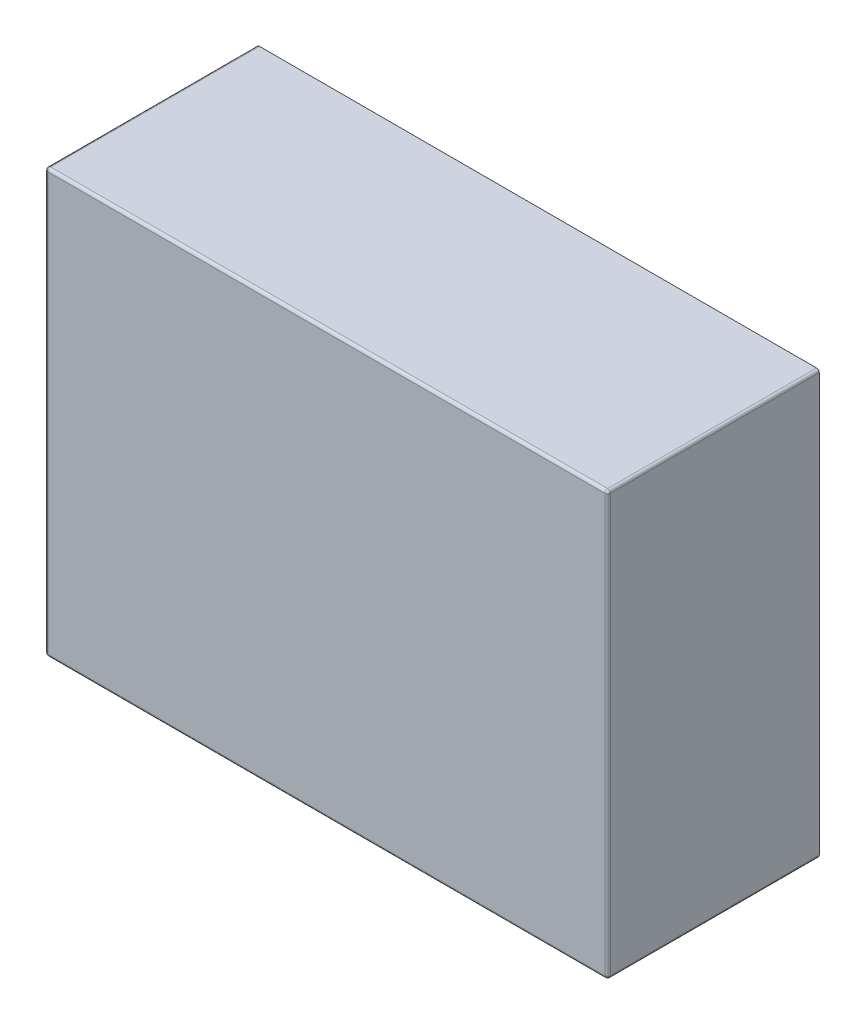
ISO-10303-21;
HEADER;
FILE_DESCRIPTION(('STEP AP214'),'2;1');
FILE_NAME('part.step','',(''),(''),'','','');
FILE_SCHEMA(('AUTOMOTIVE_DESIGN { 1 0 10303 214 1 1 1 1 }'));
ENDSEC;
DATA;
#1=APPLICATION_CONTEXT('core data for automotive mechanical design processes');
#2=APPLICATION_PROTOCOL_DEFINITION('international standard','automotive_design',2000,#1);
#3=PRODUCT_CONTEXT('',#1,'mechanical');
#4=PRODUCT('Part','Part','',(#3));
#5=PRODUCT_RELATED_PRODUCT_CATEGORY('part','',(#4));
#6=PRODUCT_DEFINITION_FORMATION('','',#4);
#7=PRODUCT_DEFINITION_CONTEXT('part definition',#1,'design');
#8=PRODUCT_DEFINITION('design','',#6,#7);
#9=PRODUCT_DEFINITION_SHAPE('','',#8);
#10=(LENGTH_UNIT() NAMED_UNIT(*) SI_UNIT(.MILLI.,.METRE.));
#11=(NAMED_UNIT(*) PLANE_ANGLE_UNIT() SI_UNIT($,.RADIAN.));
#12=(NAMED_UNIT(*) SI_UNIT($,.STERADIAN.) SOLID_ANGLE_UNIT());
#13=UNCERTAINTY_MEASURE_WITH_UNIT(LENGTH_MEASURE(1.E-05),#10,'distance_accuracy_value','');
#14=(GEOMETRIC_REPRESENTATION_CONTEXT(3) GLOBAL_UNCERTAINTY_ASSIGNED_CONTEXT((#13)) GLOBAL_UNIT_ASSIGNED_CONTEXT((#10,
#11,#12)) REPRESENTATION_CONTEXT('',''));
#15=CARTESIAN_POINT('',(0.,0.,0.));
#16=DIRECTION('',(0.,0.,1.));
#17=DIRECTION('',(1.,0.,0.));
#18=AXIS2_PLACEMENT_3D('',#15,#16,#17);
#19=CARTESIAN_POINT('',(0.,0.,152.));
#20=DIRECTION('',(0.,0.,1.));
#21=DIRECTION('',(1.,0.,0.));
#22=AXIS2_PLACEMENT_3D('',#19,#20,#21);
#23=PLANE('',#22);
#24=DIRECTION('',(1.,0.,0.));
#25=VECTOR('',#24,1.);
#26=CARTESIAN_POINT('',(-200.,-150.,152.));
#27=LINE('',#26,#25);
#28=CARTESIAN_POINT('',(-200.,-150.,152.));
#29=VERTEX_POINT('',#28);
#30=CARTESIAN_POINT('',(200.,-150.,152.));
#31=VERTEX_POINT('',#30);
#32=EDGE_CURVE('E315',#29,#31,#27,.T.);
#33=ORIENTED_EDGE('',*,*,#32,.T.);
#34=DIRECTION('',(0.,1.,0.));
#35=VECTOR('',#34,1.);
#36=CARTESIAN_POINT('',(200.,-150.,152.));
#37=LINE('',#36,#35);
#38=CARTESIAN_POINT('',(200.,150.,152.));
#39=VERTEX_POINT('',#38);
#40=EDGE_CURVE('E45',#31,#39,#37,.T.);
#41=ORIENTED_EDGE('',*,*,#40,.T.);
#42=DIRECTION('',(-1.,0.,0.));
#43=VECTOR('',#42,1.);
#44=CARTESIAN_POINT('',(200.,150.,152.));
#45=LINE('',#44,#43);
#46=CARTESIAN_POINT('',(-200.,150.,152.));
#47=VERTEX_POINT('',#46);
#48=EDGE_CURVE('E10',#39,#47,#45,.T.);
#49=ORIENTED_EDGE('',*,*,#48,.T.);
#50=DIRECTION('',(0.,-1.,0.));
#51=VECTOR('',#50,1.);
#52=CARTESIAN_POINT('',(-200.,150.,152.));
#53=LINE('',#52,#51);
#54=EDGE_CURVE('E282',#47,#29,#53,.T.);
#55=ORIENTED_EDGE('',*,*,#54,.T.);
#56=EDGE_LOOP('',(#33,#41,#49,#55));
#57=FACE_BOUND('',#56,.T.);
#58=ADVANCED_FACE('F16',(#57),#23,.T.);
#59=CARTESIAN_POINT('',(200.,150.,150.));
#60=DIRECTION('',(-1.,0.,0.));
#61=DIRECTION('',(0.,0.,-1.));
#62=AXIS2_PLACEMENT_3D('',#59,#60,#61);
#63=CYLINDRICAL_SURFACE('',#62,2.);
#64=CARTESIAN_POINT('',(-200.,150.,150.));
#65=DIRECTION('',(1.,0.,0.));
#66=DIRECTION('',(0.,0.,-1.));
#67=AXIS2_PLACEMENT_3D('',#64,#65,#66);
#68=CIRCLE('',#67,2.);
#69=CARTESIAN_POINT('',(-200.,152.,150.));
#70=VERTEX_POINT('',#69);
#71=EDGE_CURVE('E283',#70,#47,#68,.T.);
#72=ORIENTED_EDGE('',*,*,#71,.T.);
#73=ORIENTED_EDGE('',*,*,#48,.F.);
#74=CARTESIAN_POINT('',(200.,150.,150.));
#75=DIRECTION('',(1.,0.,0.));
#76=DIRECTION('',(0.,0.,-1.));
#77=AXIS2_PLACEMENT_3D('',#74,#75,#76);
#78=CIRCLE('',#77,2.);
#79=CARTESIAN_POINT('',(200.,152.,150.));
#80=VERTEX_POINT('',#79);
#81=EDGE_CURVE('E25',#80,#39,#78,.T.);
#82=ORIENTED_EDGE('',*,*,#81,.F.);
#83=DIRECTION('',(-1.,0.,0.));
#84=VECTOR('',#83,1.);
#85=CARTESIAN_POINT('',(200.,152.,150.));
#86=LINE('',#85,#84);
#87=EDGE_CURVE('E302',#80,#70,#86,.T.);
#88=ORIENTED_EDGE('',*,*,#87,.T.);
#89=EDGE_LOOP('',(#72,#73,#82,#88));
#90=FACE_BOUND('',#89,.T.);
#91=ADVANCED_FACE('F366',(#90),#63,.T.);
#92=CARTESIAN_POINT('',(200.,150.,150.));
#93=DIRECTION('',(0.,0.707106781186548,-0.707106781186548));
#94=DIRECTION('',(-0.577350269189626,-0.577350269189626,-0.577350269189626));
#95=AXIS2_PLACEMENT_3D('',#92,#93,#94);
#96=SPHERICAL_SURFACE('',#95,2.);
#97=CARTESIAN_POINT('',(200.,150.,150.));
#98=DIRECTION('',(0.,0.,1.));
#99=DIRECTION('',(0.,-1.,0.));
#100=AXIS2_PLACEMENT_3D('',#97,#98,#99);
#101=CIRCLE('',#100,2.);
#102=CARTESIAN_POINT('',(202.,150.,150.));
#103=VERTEX_POINT('',#102);
#104=EDGE_CURVE('E244',#103,#80,#101,.T.);
#105=ORIENTED_EDGE('',*,*,#104,.T.);
#106=ORIENTED_EDGE('',*,*,#81,.T.);
#107=CARTESIAN_POINT('',(200.,150.,150.));
#108=DIRECTION('',(0.,-1.,0.));
#109=DIRECTION('',(0.,0.,-1.));
#110=AXIS2_PLACEMENT_3D('',#107,#108,#109);
#111=CIRCLE('',#110,2.);
#112=EDGE_CURVE('E189',#103,#39,#111,.T.);
#113=ORIENTED_EDGE('',*,*,#112,.F.);
#114=EDGE_LOOP('',(#105,#106,#113));
#115=FACE_BOUND('',#114,.T.);
#116=ADVANCED_FACE('F334',(#115),#96,.T.);
#117=CARTESIAN_POINT('',(200.,-150.,150.));
#118=DIRECTION('',(0.,1.,0.));
#119=DIRECTION('',(0.,0.,-1.));
#120=AXIS2_PLACEMENT_3D('',#117,#118,#119);
#121=CYLINDRICAL_SURFACE('',#120,2.);
#122=ORIENTED_EDGE('',*,*,#112,.T.);
#123=ORIENTED_EDGE('',*,*,#40,.F.);
#124=CARTESIAN_POINT('',(200.,-150.,150.));
#125=DIRECTION('',(0.,-1.,0.));
#126=DIRECTION('',(0.,0.,-1.));
#127=AXIS2_PLACEMENT_3D('',#124,#125,#126);
#128=CIRCLE('',#127,2.);
#129=CARTESIAN_POINT('',(202.,-150.,150.));
#130=VERTEX_POINT('',#129);
#131=EDGE_CURVE('E312',#130,#31,#128,.T.);
#132=ORIENTED_EDGE('',*,*,#131,.F.);
#133=DIRECTION('',(0.,1.,0.));
#134=VECTOR('',#133,1.);
#135=CARTESIAN_POINT('',(202.,-150.,150.));
#136=LINE('',#135,#134);
#137=EDGE_CURVE('E292',#130,#103,#136,.T.);
#138=ORIENTED_EDGE('',*,*,#137,.T.);
#139=EDGE_LOOP('',(#122,#123,#132,#138));
#140=FACE_BOUND('',#139,.T.);
#141=ADVANCED_FACE('F339',(#140),#121,.T.);
#142=CARTESIAN_POINT('',(200.,-150.,150.));
#143=DIRECTION('',(0.707106781186548,0.,-0.707106781186548));
#144=DIRECTION('',(-0.577350269189626,0.577350269189626,-0.577350269189626));
#145=AXIS2_PLACEMENT_3D('',#142,#143,#144);
#146=SPHERICAL_SURFACE('',#145,2.);
#147=CARTESIAN_POINT('',(200.,-150.,150.));
#148=DIRECTION('',(0.,0.,1.));
#149=DIRECTION('',(-1.,0.,0.));
#150=AXIS2_PLACEMENT_3D('',#147,#148,#149);
#151=CIRCLE('',#150,2.);
#152=CARTESIAN_POINT('',(200.,-152.,150.));
#153=VERTEX_POINT('',#152);
#154=EDGE_CURVE('E288',#153,#130,#151,.T.);
#155=ORIENTED_EDGE('',*,*,#154,.T.);
#156=ORIENTED_EDGE('',*,*,#131,.T.);
#157=CARTESIAN_POINT('',(200.,-150.,150.));
#158=DIRECTION('',(-1.,0.,0.));
#159=DIRECTION('',(0.,0.,-1.));
#160=AXIS2_PLACEMENT_3D('',#157,#158,#159);
#161=CIRCLE('',#160,2.);
#162=EDGE_CURVE('E323',#153,#31,#161,.T.);
#163=ORIENTED_EDGE('',*,*,#162,.F.);
#164=EDGE_LOOP('',(#155,#156,#163));
#165=FACE_BOUND('',#164,.T.);
#166=ADVANCED_FACE('F18',(#165),#146,.T.);
#167=CARTESIAN_POINT('',(-200.,-150.,150.));
#168=DIRECTION('',(1.,0.,0.));
#169=DIRECTION('',(0.,0.,-1.));
#170=AXIS2_PLACEMENT_3D('',#167,#168,#169);
#171=CYLINDRICAL_SURFACE('',#170,2.);
#172=ORIENTED_EDGE('',*,*,#162,.T.);
#173=ORIENTED_EDGE('',*,*,#32,.F.);
#174=CARTESIAN_POINT('',(-200.,-150.,150.));
#175=DIRECTION('',(-1.,0.,0.));
#176=DIRECTION('',(0.,0.,-1.));
#177=AXIS2_PLACEMENT_3D('',#174,#175,#176);
#178=CIRCLE('',#177,2.);
#179=CARTESIAN_POINT('',(-200.,-152.,150.));
#180=VERTEX_POINT('',#179);
#181=EDGE_CURVE('E319',#180,#29,#178,.T.);
#182=ORIENTED_EDGE('',*,*,#181,.F.);
#183=DIRECTION('',(1.,0.,0.));
#184=VECTOR('',#183,1.);
#185=CARTESIAN_POINT('',(-200.,-152.,150.));
#186=LINE('',#185,#184);
#187=EDGE_CURVE('E277',#180,#153,#186,.T.);
#188=ORIENTED_EDGE('',*,*,#187,.T.);
#189=EDGE_LOOP('',(#172,#173,#182,#188));
#190=FACE_BOUND('',#189,.T.);
#191=ADVANCED_FACE('F384',(#190),#171,.T.);
#192=CARTESIAN_POINT('',(-200.,-150.,150.));
#193=DIRECTION('',(0.707106781186548,0.,0.707106781186548));
#194=DIRECTION('',(0.577350269189626,0.577350269189626,-0.577350269189626));
#195=AXIS2_PLACEMENT_3D('',#192,#193,#194);
#196=SPHERICAL_SURFACE('',#195,2.);
#197=CARTESIAN_POINT('',(-200.,-150.,150.));
#198=DIRECTION('',(0.,0.,-1.));
#199=DIRECTION('',(1.,0.,0.));
#200=AXIS2_PLACEMENT_3D('',#197,#198,#199);
#201=CIRCLE('',#200,2.);
#202=CARTESIAN_POINT('',(-202.,-150.,150.));
#203=VERTEX_POINT('',#202);
#204=EDGE_CURVE('E269',#180,#203,#201,.T.);
#205=ORIENTED_EDGE('',*,*,#204,.F.);
#206=ORIENTED_EDGE('',*,*,#181,.T.);
#207=CARTESIAN_POINT('',(-200.,-150.,150.));
#208=DIRECTION('',(0.,1.,0.));
#209=DIRECTION('',(0.,0.,-1.));
#210=AXIS2_PLACEMENT_3D('',#207,#208,#209);
#211=CIRCLE('',#210,2.);
#212=EDGE_CURVE('E278',#203,#29,#211,.T.);
#213=ORIENTED_EDGE('',*,*,#212,.F.);
#214=EDGE_LOOP('',(#205,#206,#213));
#215=FACE_BOUND('',#214,.T.);
#216=ADVANCED_FACE('F381',(#215),#196,.T.);
#217=CARTESIAN_POINT('',(-200.,150.,150.));
#218=DIRECTION('',(0.,-1.,0.));
#219=DIRECTION('',(0.,0.,-1.));
#220=AXIS2_PLACEMENT_3D('',#217,#218,#219);
#221=CYLINDRICAL_SURFACE('',#220,2.);
#222=ORIENTED_EDGE('',*,*,#212,.T.);
#223=ORIENTED_EDGE('',*,*,#54,.F.);
#224=CARTESIAN_POINT('',(-200.,150.,150.));
#225=DIRECTION('',(0.,1.,0.));
#226=DIRECTION('',(0.,0.,-1.));
#227=AXIS2_PLACEMENT_3D('',#224,#225,#226);
#228=CIRCLE('',#227,2.);
#229=CARTESIAN_POINT('',(-202.,150.,150.));
#230=VERTEX_POINT('',#229);
#231=EDGE_CURVE('E306',#230,#47,#228,.T.);
#232=ORIENTED_EDGE('',*,*,#231,.F.);
#233=DIRECTION('',(0.,-1.,0.));
#234=VECTOR('',#233,1.);
#235=CARTESIAN_POINT('',(-202.,150.,150.));
#236=LINE('',#235,#234);
#237=EDGE_CURVE('E190',#230,#203,#236,.T.);
#238=ORIENTED_EDGE('',*,*,#237,.T.);
#239=EDGE_LOOP('',(#222,#223,#232,#238));
#240=FACE_BOUND('',#239,.T.);
#241=ADVANCED_FACE('F371',(#240),#221,.T.);
#242=CARTESIAN_POINT('',(-200.,150.,150.));
#243=DIRECTION('',(-0.707106781186548,0.,-0.707106781186548));
#244=DIRECTION('',(0.577350269189626,-0.577350269189626,-0.577350269189626));
#245=AXIS2_PLACEMENT_3D('',#242,#243,#244);
#246=SPHERICAL_SURFACE('',#245,2.);
#247=CARTESIAN_POINT('',(-200.,150.,150.));
#248=DIRECTION('',(0.,0.,1.));
#249=DIRECTION('',(1.,0.,0.));
#250=AXIS2_PLACEMENT_3D('',#247,#248,#249);
#251=CIRCLE('',#250,2.);
#252=EDGE_CURVE('E255',#70,#230,#251,.T.);
#253=ORIENTED_EDGE('',*,*,#252,.T.);
#254=ORIENTED_EDGE('',*,*,#231,.T.);
#255=ORIENTED_EDGE('',*,*,#71,.F.);
#256=EDGE_LOOP('',(#253,#254,#255));
#257=FACE_BOUND('',#256,.T.);
#258=ADVANCED_FACE('F368',(#257),#246,.T.);
#259=CARTESIAN_POINT('',(200.,152.,0.));
#260=DIRECTION('',(0.,-1.,0.));
#261=DIRECTION('',(0.,0.,-1.));
#262=AXIS2_PLACEMENT_3D('',#259,#260,#261);
#263=PLANE('',#262);
#264=ORIENTED_EDGE('',*,*,#87,.F.);
#265=DIRECTION('',(0.,0.,1.));
#266=VECTOR('',#265,1.);
#267=CARTESIAN_POINT('',(200.,152.,0.));
#268=LINE('',#267,#266);
#269=CARTESIAN_POINT('',(200.,152.,0.));
#270=VERTEX_POINT('',#269);
#271=EDGE_CURVE('E240',#270,#80,#268,.T.);
#272=ORIENTED_EDGE('',*,*,#271,.F.);
#273=DIRECTION('',(-1.,0.,0.));
#274=VECTOR('',#273,1.);
#275=CARTESIAN_POINT('',(200.,152.,0.));
#276=LINE('',#275,#274);
#277=CARTESIAN_POINT('',(-200.,152.,0.));
#278=VERTEX_POINT('',#277);
#279=EDGE_CURVE('E202',#270,#278,#276,.T.);
#280=ORIENTED_EDGE('',*,*,#279,.T.);
#281=DIRECTION('',(0.,0.,1.));
#282=VECTOR('',#281,1.);
#283=CARTESIAN_POINT('',(-200.,152.,0.));
#284=LINE('',#283,#282);
#285=EDGE_CURVE('E259',#278,#70,#284,.T.);
#286=ORIENTED_EDGE('',*,*,#285,.T.);
#287=EDGE_LOOP('',(#264,#272,#280,#286));
#288=FACE_BOUND('',#287,.T.);
#289=ADVANCED_FACE('F364',(#288),#263,.F.);
#290=CARTESIAN_POINT('',(200.,150.,0.));
#291=DIRECTION('',(0.,0.,1.));
#292=DIRECTION('',(0.,-1.,0.));
#293=AXIS2_PLACEMENT_3D('',#290,#291,#292);
#294=CYLINDRICAL_SURFACE('',#293,2.);
#295=ORIENTED_EDGE('',*,*,#271,.T.);
#296=ORIENTED_EDGE('',*,*,#104,.F.);
#297=DIRECTION('',(0.,0.,1.));
#298=VECTOR('',#297,1.);
#299=CARTESIAN_POINT('',(202.,150.,0.));
#300=LINE('',#299,#298);
#301=CARTESIAN_POINT('',(202.,150.,0.));
#302=VERTEX_POINT('',#301);
#303=EDGE_CURVE('E245',#302,#103,#300,.T.);
#304=ORIENTED_EDGE('',*,*,#303,.F.);
#305=CARTESIAN_POINT('',(200.,150.,0.));
#306=DIRECTION('',(0.,0.,1.));
#307=DIRECTION('',(0.,-1.,0.));
#308=AXIS2_PLACEMENT_3D('',#305,#306,#307);
#309=CIRCLE('',#308,2.);
#310=EDGE_CURVE('E206',#302,#270,#309,.T.);
#311=ORIENTED_EDGE('',*,*,#310,.T.);
#312=EDGE_LOOP('',(#295,#296,#304,#311));
#313=FACE_BOUND('',#312,.T.);
#314=ADVANCED_FACE('F362',(#313),#294,.T.);
#315=CARTESIAN_POINT('',(202.,-150.,0.));
#316=DIRECTION('',(-1.,0.,0.));
#317=DIRECTION('',(0.,0.,1.));
#318=AXIS2_PLACEMENT_3D('',#315,#316,#317);
#319=PLANE('',#318);
#320=ORIENTED_EDGE('',*,*,#137,.F.);
#321=DIRECTION('',(0.,0.,1.));
#322=VECTOR('',#321,1.);
#323=CARTESIAN_POINT('',(202.,-150.,0.));
#324=LINE('',#323,#322);
#325=CARTESIAN_POINT('',(202.,-150.,0.));
#326=VERTEX_POINT('',#325);
#327=EDGE_CURVE('E284',#326,#130,#324,.T.);
#328=ORIENTED_EDGE('',*,*,#327,.F.);
#329=DIRECTION('',(0.,1.,0.));
#330=VECTOR('',#329,1.);
#331=CARTESIAN_POINT('',(202.,-150.,0.));
#332=LINE('',#331,#330);
#333=EDGE_CURVE('E236',#326,#302,#332,.T.);
#334=ORIENTED_EDGE('',*,*,#333,.T.);
#335=ORIENTED_EDGE('',*,*,#303,.T.);
#336=EDGE_LOOP('',(#320,#328,#334,#335));
#337=FACE_BOUND('',#336,.T.);
#338=ADVANCED_FACE('F356',(#337),#319,.F.);
#339=CARTESIAN_POINT('',(200.,-150.,0.));
#340=DIRECTION('',(0.,0.,1.));
#341=DIRECTION('',(-1.,0.,0.));
#342=AXIS2_PLACEMENT_3D('',#339,#340,#341);
#343=CYLINDRICAL_SURFACE('',#342,2.);
#344=ORIENTED_EDGE('',*,*,#327,.T.);
#345=ORIENTED_EDGE('',*,*,#154,.F.);
#346=DIRECTION('',(0.,0.,1.));
#347=VECTOR('',#346,1.);
#348=CARTESIAN_POINT('',(200.,-152.,0.));
#349=LINE('',#348,#347);
#350=CARTESIAN_POINT('',(200.,-152.,0.));
#351=VERTEX_POINT('',#350);
#352=EDGE_CURVE('E273',#351,#153,#349,.T.);
#353=ORIENTED_EDGE('',*,*,#352,.F.);
#354=CARTESIAN_POINT('',(200.,-150.,0.));
#355=DIRECTION('',(0.,0.,1.));
#356=DIRECTION('',(-1.,0.,0.));
#357=AXIS2_PLACEMENT_3D('',#354,#355,#356);
#358=CIRCLE('',#357,2.);
#359=EDGE_CURVE('E232',#351,#326,#358,.T.);
#360=ORIENTED_EDGE('',*,*,#359,.T.);
#361=EDGE_LOOP('',(#344,#345,#353,#360));
#362=FACE_BOUND('',#361,.T.);
#363=ADVANCED_FACE('F389',(#362),#343,.T.);
#364=CARTESIAN_POINT('',(-200.,-152.,0.));
#365=DIRECTION('',(0.,1.,0.));
#366=DIRECTION('',(1.,0.,0.));
#367=AXIS2_PLACEMENT_3D('',#364,#365,#366);
#368=PLANE('',#367);
#369=DIRECTION('',(1.,0.,0.));
#370=VECTOR('',#369,1.);
#371=CARTESIAN_POINT('',(-200.,-152.,0.));
#372=LINE('',#371,#370);
#373=CARTESIAN_POINT('',(-200.,-152.,0.));
#374=VERTEX_POINT('',#373);
#375=EDGE_CURVE('E211',#374,#351,#372,.T.);
#376=ORIENTED_EDGE('',*,*,#375,.T.);
#377=ORIENTED_EDGE('',*,*,#352,.T.);
#378=ORIENTED_EDGE('',*,*,#187,.F.);
#379=DIRECTION('',(0.,0.,1.));
#380=VECTOR('',#379,1.);
#381=CARTESIAN_POINT('',(-200.,-152.,0.));
#382=LINE('',#381,#380);
#383=EDGE_CURVE('E192',#374,#180,#382,.T.);
#384=ORIENTED_EDGE('',*,*,#383,.F.);
#385=EDGE_LOOP('',(#376,#377,#378,#384));
#386=FACE_BOUND('',#385,.T.);
#387=ADVANCED_FACE('F386',(#386),#368,.F.);
#388=CARTESIAN_POINT('',(-200.,-150.,0.));
#389=DIRECTION('',(0.,0.,1.));
#390=DIRECTION('',(1.,0.,0.));
#391=AXIS2_PLACEMENT_3D('',#388,#389,#390);
#392=CYLINDRICAL_SURFACE('',#391,2.);
#393=CARTESIAN_POINT('',(-200.,-150.,0.));
#394=DIRECTION('',(0.,0.,-1.));
#395=DIRECTION('',(1.,0.,0.));
#396=AXIS2_PLACEMENT_3D('',#393,#394,#395);
#397=CIRCLE('',#396,2.);
#398=CARTESIAN_POINT('',(-202.,-150.,0.));
#399=VERTEX_POINT('',#398);
#400=EDGE_CURVE('E207',#374,#399,#397,.T.);
#401=ORIENTED_EDGE('',*,*,#400,.F.);
#402=ORIENTED_EDGE('',*,*,#383,.T.);
#403=ORIENTED_EDGE('',*,*,#204,.T.);
#404=DIRECTION('',(0.,0.,1.));
#405=VECTOR('',#404,1.);
#406=CARTESIAN_POINT('',(-202.,-150.,0.));
#407=LINE('',#406,#405);
#408=EDGE_CURVE('E193',#399,#203,#407,.T.);
#409=ORIENTED_EDGE('',*,*,#408,.F.);
#410=EDGE_LOOP('',(#401,#402,#403,#409));
#411=FACE_BOUND('',#410,.T.);
#412=ADVANCED_FACE('F377',(#411),#392,.T.);
#413=CARTESIAN_POINT('',(-202.,150.,0.));
#414=DIRECTION('',(1.,0.,0.));
#415=DIRECTION('',(0.,1.,0.));
#416=AXIS2_PLACEMENT_3D('',#413,#414,#415);
#417=PLANE('',#416);
#418=ORIENTED_EDGE('',*,*,#408,.T.);
#419=ORIENTED_EDGE('',*,*,#237,.F.);
#420=DIRECTION('',(0.,0.,1.));
#421=VECTOR('',#420,1.);
#422=CARTESIAN_POINT('',(-202.,150.,0.));
#423=LINE('',#422,#421);
#424=CARTESIAN_POINT('',(-202.,150.,0.));
#425=VERTEX_POINT('',#424);
#426=EDGE_CURVE('E198',#425,#230,#423,.T.);
#427=ORIENTED_EDGE('',*,*,#426,.F.);
#428=DIRECTION('',(0.,-1.,0.));
#429=VECTOR('',#428,1.);
#430=CARTESIAN_POINT('',(-202.,150.,0.));
#431=LINE('',#430,#429);
#432=EDGE_CURVE('E210',#425,#399,#431,.T.);
#433=ORIENTED_EDGE('',*,*,#432,.T.);
#434=EDGE_LOOP('',(#418,#419,#427,#433));
#435=FACE_BOUND('',#434,.T.);
#436=ADVANCED_FACE('F373',(#435),#417,.F.);
#437=CARTESIAN_POINT('',(-200.,150.,0.));
#438=DIRECTION('',(0.,0.,1.));
#439=DIRECTION('',(1.,0.,0.));
#440=AXIS2_PLACEMENT_3D('',#437,#438,#439);
#441=CYLINDRICAL_SURFACE('',#440,2.);
#442=ORIENTED_EDGE('',*,*,#426,.T.);
#443=ORIENTED_EDGE('',*,*,#252,.F.);
#444=ORIENTED_EDGE('',*,*,#285,.F.);
#445=CARTESIAN_POINT('',(-200.,150.,0.));
#446=DIRECTION('',(0.,0.,1.));
#447=DIRECTION('',(1.,0.,0.));
#448=AXIS2_PLACEMENT_3D('',#445,#446,#447);
#449=CIRCLE('',#448,2.);
#450=EDGE_CURVE('E199',#278,#425,#449,.T.);
#451=ORIENTED_EDGE('',*,*,#450,.T.);
#452=EDGE_LOOP('',(#442,#443,#444,#451));
#453=FACE_BOUND('',#452,.T.);
#454=ADVANCED_FACE('F414',(#453),#441,.T.);
#455=CARTESIAN_POINT('',(200.,150.,0.));
#456=DIRECTION('',(0.,-1.,0.));
#457=DIRECTION('',(0.,0.,-1.));
#458=AXIS2_PLACEMENT_3D('',#455,#456,#457);
#459=PLANE('',#458);
#460=DIRECTION('',(0.,0.,1.));
#461=VECTOR('',#460,1.);
#462=CARTESIAN_POINT('',(200.,150.,0.));
#463=LINE('',#462,#461);
#464=CARTESIAN_POINT('',(200.,150.,0.));
#465=VERTEX_POINT('',#464);
#466=CARTESIAN_POINT('',(200.,150.,150.));
#467=VERTEX_POINT('',#466);
#468=EDGE_CURVE('E218',#465,#467,#463,.T.);
#469=ORIENTED_EDGE('',*,*,#468,.T.);
#470=DIRECTION('',(-1.,0.,0.));
#471=VECTOR('',#470,1.);
#472=CARTESIAN_POINT('',(200.,150.,150.));
#473=LINE('',#472,#471);
#474=CARTESIAN_POINT('',(-200.,150.,150.));
#475=VERTEX_POINT('',#474);
#476=EDGE_CURVE('E195',#467,#475,#473,.T.);
#477=ORIENTED_EDGE('',*,*,#476,.T.);
#478=DIRECTION('',(0.,0.,1.));
#479=VECTOR('',#478,1.);
#480=CARTESIAN_POINT('',(-200.,150.,0.));
#481=LINE('',#480,#479);
#482=CARTESIAN_POINT('',(-200.,150.,0.));
#483=VERTEX_POINT('',#482);
#484=EDGE_CURVE('E174',#483,#475,#481,.T.);
#485=ORIENTED_EDGE('',*,*,#484,.F.);
#486=DIRECTION('',(-1.,0.,0.));
#487=VECTOR('',#486,1.);
#488=CARTESIAN_POINT('',(200.,150.,0.));
#489=LINE('',#488,#487);
#490=EDGE_CURVE('E157',#465,#483,#489,.T.);
#491=ORIENTED_EDGE('',*,*,#490,.F.);
#492=EDGE_LOOP('',(#469,#477,#485,#491));
#493=FACE_BOUND('',#492,.T.);
#494=ADVANCED_FACE('F410',(#493),#459,.T.);
#495=CARTESIAN_POINT('',(0.,0.,150.));
#496=DIRECTION('',(0.,0.,1.));
#497=DIRECTION('',(1.,0.,0.));
#498=AXIS2_PLACEMENT_3D('',#495,#496,#497);
#499=PLANE('',#498);
#500=DIRECTION('',(0.,-1.,0.));
#501=VECTOR('',#500,1.);
#502=CARTESIAN_POINT('',(-200.,150.,150.));
#503=LINE('',#502,#501);
#504=CARTESIAN_POINT('',(-200.,-150.,150.));
#505=VERTEX_POINT('',#504);
#506=EDGE_CURVE('E164',#475,#505,#503,.T.);
#507=ORIENTED_EDGE('',*,*,#506,.F.);
#508=ORIENTED_EDGE('',*,*,#476,.F.);
#509=DIRECTION('',(0.,1.,0.));
#510=VECTOR('',#509,1.);
#511=CARTESIAN_POINT('',(200.,-150.,150.));
#512=LINE('',#511,#510);
#513=CARTESIAN_POINT('',(200.,-150.,150.));
#514=VERTEX_POINT('',#513);
#515=EDGE_CURVE('E163',#514,#467,#512,.T.);
#516=ORIENTED_EDGE('',*,*,#515,.F.);
#517=DIRECTION('',(1.,0.,0.));
#518=VECTOR('',#517,1.);
#519=CARTESIAN_POINT('',(-200.,-150.,150.));
#520=LINE('',#519,#518);
#521=EDGE_CURVE('E180',#505,#514,#520,.T.);
#522=ORIENTED_EDGE('',*,*,#521,.F.);
#523=EDGE_LOOP('',(#507,#508,#516,#522));
#524=FACE_BOUND('',#523,.T.);
#525=ADVANCED_FACE('F407',(#524),#499,.F.);
#526=CARTESIAN_POINT('',(0.,0.,0.));
#527=DIRECTION('',(0.,0.,1.));
#528=DIRECTION('',(1.,0.,0.));
#529=AXIS2_PLACEMENT_3D('',#526,#527,#528);
#530=PLANE('',#529);
#531=ORIENTED_EDGE('',*,*,#279,.F.);
#532=ORIENTED_EDGE('',*,*,#310,.F.);
#533=ORIENTED_EDGE('',*,*,#333,.F.);
#534=ORIENTED_EDGE('',*,*,#359,.F.);
#535=ORIENTED_EDGE('',*,*,#375,.F.);
#536=ORIENTED_EDGE('',*,*,#400,.T.);
#537=ORIENTED_EDGE('',*,*,#432,.F.);
#538=ORIENTED_EDGE('',*,*,#450,.F.);
#539=EDGE_LOOP('',(#531,#532,#533,#534,#535,#536,#537,#538));
#540=FACE_BOUND('',#539,.T.);
#541=DIRECTION('',(0.,1.,0.));
#542=VECTOR('',#541,1.);
#543=CARTESIAN_POINT('',(200.,-150.,0.));
#544=LINE('',#543,#542);
#545=CARTESIAN_POINT('',(200.,-150.,0.));
#546=VERTEX_POINT('',#545);
#547=EDGE_CURVE('E215',#546,#465,#544,.T.);
#548=ORIENTED_EDGE('',*,*,#547,.T.);
#549=ORIENTED_EDGE('',*,*,#490,.T.);
#550=DIRECTION('',(0.,-1.,0.));
#551=VECTOR('',#550,1.);
#552=CARTESIAN_POINT('',(-200.,150.,0.));
#553=LINE('',#552,#551);
#554=CARTESIAN_POINT('',(-200.,-150.,0.));
#555=VERTEX_POINT('',#554);
#556=EDGE_CURVE('E151',#483,#555,#553,.T.);
#557=ORIENTED_EDGE('',*,*,#556,.T.);
#558=DIRECTION('',(1.,0.,0.));
#559=VECTOR('',#558,1.);
#560=CARTESIAN_POINT('',(-200.,-150.,0.));
#561=LINE('',#560,#559);
#562=EDGE_CURVE('E155',#555,#546,#561,.T.);
#563=ORIENTED_EDGE('',*,*,#562,.T.);
#564=EDGE_LOOP('',(#548,#549,#557,#563));
#565=FACE_BOUND('',#564,.T.);
#566=ADVANCED_FACE('F154',(#540,#565),#530,.F.);
#567=CARTESIAN_POINT('',(200.,-150.,0.));
#568=DIRECTION('',(-1.,0.,0.));
#569=DIRECTION('',(0.,0.,1.));
#570=AXIS2_PLACEMENT_3D('',#567,#568,#569);
#571=PLANE('',#570);
#572=DIRECTION('',(0.,0.,1.));
#573=VECTOR('',#572,1.);
#574=CARTESIAN_POINT('',(200.,-150.,0.));
#575=LINE('',#574,#573);
#576=EDGE_CURVE('E172',#546,#514,#575,.T.);
#577=ORIENTED_EDGE('',*,*,#576,.T.);
#578=ORIENTED_EDGE('',*,*,#515,.T.);
#579=ORIENTED_EDGE('',*,*,#468,.F.);
#580=ORIENTED_EDGE('',*,*,#547,.F.);
#581=EDGE_LOOP('',(#577,#578,#579,#580));
#582=FACE_BOUND('',#581,.T.);
#583=ADVANCED_FACE('F513',(#582),#571,.T.);
#584=CARTESIAN_POINT('',(-200.,150.,0.));
#585=DIRECTION('',(1.,0.,0.));
#586=DIRECTION('',(0.,1.,0.));
#587=AXIS2_PLACEMENT_3D('',#584,#585,#586);
#588=PLANE('',#587);
#589=ORIENTED_EDGE('',*,*,#484,.T.);
#590=ORIENTED_EDGE('',*,*,#506,.T.);
#591=DIRECTION('',(0.,0.,1.));
#592=VECTOR('',#591,1.);
#593=CARTESIAN_POINT('',(-200.,-150.,0.));
#594=LINE('',#593,#592);
#595=EDGE_CURVE('E170',#555,#505,#594,.T.);
#596=ORIENTED_EDGE('',*,*,#595,.F.);
#597=ORIENTED_EDGE('',*,*,#556,.F.);
#598=EDGE_LOOP('',(#589,#590,#596,#597));
#599=FACE_BOUND('',#598,.T.);
#600=ADVANCED_FACE('F176',(#599),#588,.T.);
#601=CARTESIAN_POINT('',(-200.,-150.,0.));
#602=DIRECTION('',(0.,1.,0.));
#603=DIRECTION('',(1.,0.,0.));
#604=AXIS2_PLACEMENT_3D('',#601,#602,#603);
#605=PLANE('',#604);
#606=ORIENTED_EDGE('',*,*,#595,.T.);
#607=ORIENTED_EDGE('',*,*,#521,.T.);
#608=ORIENTED_EDGE('',*,*,#576,.F.);
#609=ORIENTED_EDGE('',*,*,#562,.F.);
#610=EDGE_LOOP('',(#606,#607,#608,#609));
#611=FACE_BOUND('',#610,.T.);
#612=ADVANCED_FACE('F168',(#611),#605,.T.);
#613=CLOSED_SHELL('',(#58,#91,#116,#141,#166,#191,#216,#241,#258,#289,#314,#338,#363,#387,#412,
#436,#454,#494,#525,#566,#583,#600,#612));
#614=MANIFOLD_SOLID_BREP('B1',#613);
#615=ADVANCED_BREP_SHAPE_REPRESENTATION('',(#18,#614),#14);
#616=SHAPE_DEFINITION_REPRESENTATION(#9,#615);
ENDSEC;
END-ISO-10303-21;
